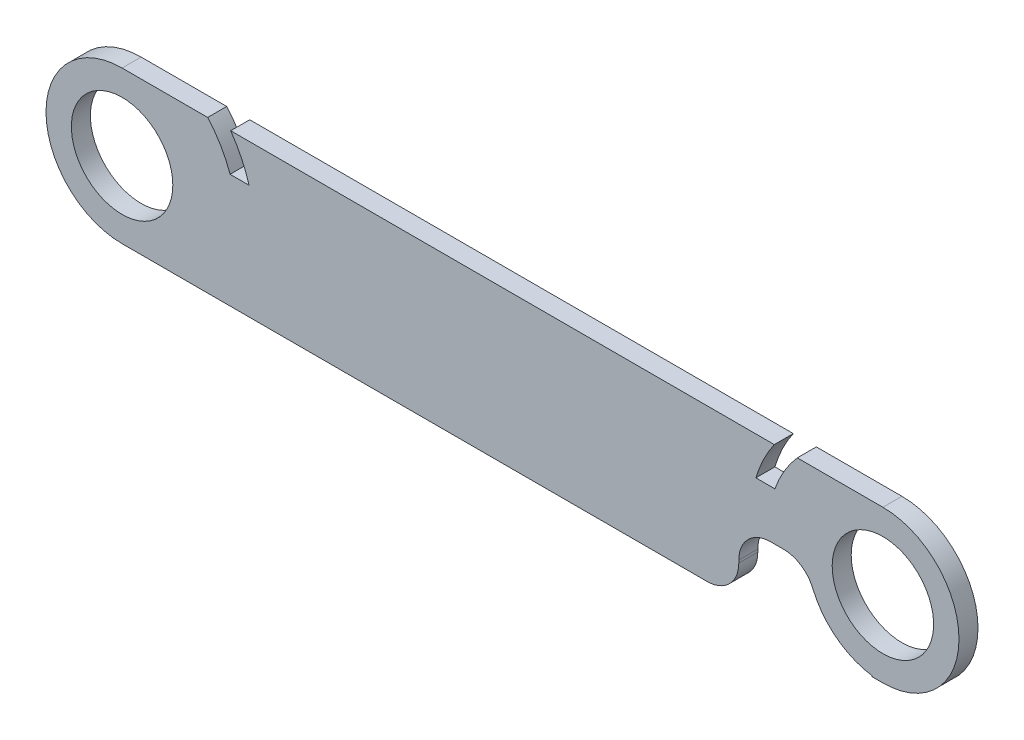
ISO-10303-21;
HEADER;
FILE_DESCRIPTION(('STEP AP214'),'2;1');
FILE_NAME('part.step','',(''),(''),'','','');
FILE_SCHEMA(('AUTOMOTIVE_DESIGN { 1 0 10303 214 1 1 1 1 }'));
ENDSEC;
DATA;
#1=APPLICATION_CONTEXT('core data for automotive mechanical design processes');
#2=APPLICATION_PROTOCOL_DEFINITION('international standard','automotive_design',2000,#1);
#3=PRODUCT_CONTEXT('',#1,'mechanical');
#4=PRODUCT('Part','Part','',(#3));
#5=PRODUCT_RELATED_PRODUCT_CATEGORY('part','',(#4));
#6=PRODUCT_DEFINITION_FORMATION('','',#4);
#7=PRODUCT_DEFINITION_CONTEXT('part definition',#1,'design');
#8=PRODUCT_DEFINITION('design','',#6,#7);
#9=PRODUCT_DEFINITION_SHAPE('','',#8);
#10=(LENGTH_UNIT() NAMED_UNIT(*) SI_UNIT(.MILLI.,.METRE.));
#11=(NAMED_UNIT(*) PLANE_ANGLE_UNIT() SI_UNIT($,.RADIAN.));
#12=(NAMED_UNIT(*) SI_UNIT($,.STERADIAN.) SOLID_ANGLE_UNIT());
#13=UNCERTAINTY_MEASURE_WITH_UNIT(LENGTH_MEASURE(1.E-05),#10,'distance_accuracy_value','');
#14=(GEOMETRIC_REPRESENTATION_CONTEXT(3) GLOBAL_UNCERTAINTY_ASSIGNED_CONTEXT((#13)) GLOBAL_UNIT_ASSIGNED_CONTEXT((#10,
#11,#12)) REPRESENTATION_CONTEXT('',''));
#15=CARTESIAN_POINT('',(0.,0.,0.));
#16=DIRECTION('',(0.,0.,1.));
#17=DIRECTION('',(1.,0.,0.));
#18=AXIS2_PLACEMENT_3D('',#15,#16,#17);
#19=CARTESIAN_POINT('',(0.,-12.,3.));
#20=DIRECTION('',(0.,1.,0.));
#21=DIRECTION('',(0.,0.,1.));
#22=AXIS2_PLACEMENT_3D('',#19,#20,#21);
#23=PLANE('',#22);
#24=DIRECTION('',(1.,0.,0.));
#25=VECTOR('',#24,1.);
#26=CARTESIAN_POINT('',(0.,-12.,3.));
#27=LINE('',#26,#25);
#28=CARTESIAN_POINT('',(-1.73119352280891,-12.,3.));
#29=VERTEX_POINT('',#28);
#30=CARTESIAN_POINT('',(0.,-12.,3.));
#31=VERTEX_POINT('',#30);
#32=EDGE_CURVE('E187',#29,#31,#27,.T.);
#33=ORIENTED_EDGE('',*,*,#32,.F.);
#34=DIRECTION('',(0.,0.,-1.));
#35=VECTOR('',#34,1.);
#36=CARTESIAN_POINT('',(-1.73119352280891,-12.,3.));
#37=LINE('',#36,#35);
#38=CARTESIAN_POINT('',(-1.73119352280891,-12.,0.));
#39=VERTEX_POINT('',#38);
#40=EDGE_CURVE('E170',#29,#39,#37,.T.);
#41=ORIENTED_EDGE('',*,*,#40,.T.);
#42=DIRECTION('',(1.,0.,0.));
#43=VECTOR('',#42,1.);
#44=CARTESIAN_POINT('',(0.,-12.,0.));
#45=LINE('',#44,#43);
#46=CARTESIAN_POINT('',(0.,-12.,0.));
#47=VERTEX_POINT('',#46);
#48=EDGE_CURVE('E215',#39,#47,#45,.T.);
#49=ORIENTED_EDGE('',*,*,#48,.T.);
#50=DIRECTION('',(0.,0.,-1.));
#51=VECTOR('',#50,1.);
#52=CARTESIAN_POINT('',(0.,-12.,3.));
#53=LINE('',#52,#51);
#54=EDGE_CURVE('E195',#31,#47,#53,.T.);
#55=ORIENTED_EDGE('',*,*,#54,.F.);
#56=EDGE_LOOP('',(#33,#41,#49,#55));
#57=FACE_BOUND('',#56,.T.);
#58=ADVANCED_FACE('F33',(#57),#23,.F.);
#59=CARTESIAN_POINT('',(0.,12.,3.));
#60=DIRECTION('',(0.,-1.,0.));
#61=DIRECTION('',(0.,0.,-1.));
#62=AXIS2_PLACEMENT_3D('',#59,#60,#61);
#63=PLANE('',#62);
#64=DIRECTION('',(-1.,0.,0.));
#65=VECTOR('',#64,1.);
#66=CARTESIAN_POINT('',(0.,12.,3.));
#67=LINE('',#66,#65);
#68=CARTESIAN_POINT('',(-106.5,12.,3.));
#69=VERTEX_POINT('',#68);
#70=CARTESIAN_POINT('',(-120.,12.,3.));
#71=VERTEX_POINT('',#70);
#72=EDGE_CURVE('E267',#69,#71,#67,.T.);
#73=ORIENTED_EDGE('',*,*,#72,.F.);
#74=DIRECTION('',(0.,0.,1.));
#75=VECTOR('',#74,1.);
#76=CARTESIAN_POINT('',(-106.5,12.,0.));
#77=LINE('',#76,#75);
#78=CARTESIAN_POINT('',(-106.5,12.,0.));
#79=VERTEX_POINT('',#78);
#80=EDGE_CURVE('E349',#79,#69,#77,.T.);
#81=ORIENTED_EDGE('',*,*,#80,.F.);
#82=DIRECTION('',(-1.,0.,0.));
#83=VECTOR('',#82,1.);
#84=CARTESIAN_POINT('',(0.,12.,0.));
#85=LINE('',#84,#83);
#86=CARTESIAN_POINT('',(-120.,12.,0.));
#87=VERTEX_POINT('',#86);
#88=EDGE_CURVE('E207',#79,#87,#85,.T.);
#89=ORIENTED_EDGE('',*,*,#88,.T.);
#90=DIRECTION('',(0.,0.,-1.));
#91=VECTOR('',#90,1.);
#92=CARTESIAN_POINT('',(-120.,12.,3.));
#93=LINE('',#92,#91);
#94=EDGE_CURVE('E224',#71,#87,#93,.T.);
#95=ORIENTED_EDGE('',*,*,#94,.F.);
#96=EDGE_LOOP('',(#73,#81,#89,#95));
#97=FACE_BOUND('',#96,.T.);
#98=ADVANCED_FACE('F285',(#97),#63,.F.);
#99=CARTESIAN_POINT('',(0.,12.,0.));
#100=VERTEX_POINT('',#99);
#101=CARTESIAN_POINT('',(-13.5,12.,0.));
#102=VERTEX_POINT('',#101);
#103=EDGE_CURVE('E209',#100,#102,#85,.T.);
#104=ORIENTED_EDGE('',*,*,#103,.T.);
#105=DIRECTION('',(0.,0.,1.));
#106=VECTOR('',#105,1.);
#107=CARTESIAN_POINT('',(-13.5,12.,0.));
#108=LINE('',#107,#106);
#109=CARTESIAN_POINT('',(-13.5,12.,3.));
#110=VERTEX_POINT('',#109);
#111=EDGE_CURVE('E368',#102,#110,#108,.T.);
#112=ORIENTED_EDGE('',*,*,#111,.T.);
#113=CARTESIAN_POINT('',(0.,12.,3.));
#114=VERTEX_POINT('',#113);
#115=EDGE_CURVE('E200',#114,#110,#67,.T.);
#116=ORIENTED_EDGE('',*,*,#115,.F.);
#117=DIRECTION('',(0.,0.,-1.));
#118=VECTOR('',#117,1.);
#119=CARTESIAN_POINT('',(0.,12.,3.));
#120=LINE('',#119,#118);
#121=EDGE_CURVE('E182',#114,#100,#120,.T.);
#122=ORIENTED_EDGE('',*,*,#121,.T.);
#123=EDGE_LOOP('',(#104,#112,#116,#122));
#124=FACE_BOUND('',#123,.T.);
#125=ADVANCED_FACE('F290',(#124),#63,.F.);
#126=CARTESIAN_POINT('',(0.,0.,3.));
#127=DIRECTION('',(0.,0.,1.));
#128=DIRECTION('',(1.,0.,0.));
#129=AXIS2_PLACEMENT_3D('',#126,#127,#128);
#130=PLANE('',#129);
#131=CARTESIAN_POINT('',(-120.,-12.,3.));
#132=VERTEX_POINT('',#131);
#133=CARTESIAN_POINT('',(-27.7311935228089,-12.,3.));
#134=VERTEX_POINT('',#133);
#135=EDGE_CURVE('E197',#132,#134,#27,.T.);
#136=ORIENTED_EDGE('',*,*,#135,.T.);
#137=CARTESIAN_POINT('',(-27.7311935228089,-7.,3.));
#138=DIRECTION('',(0.,0.,1.));
#139=DIRECTION('',(1.,0.,0.));
#140=AXIS2_PLACEMENT_3D('',#137,#138,#139);
#141=CIRCLE('',#140,5.);
#142=CARTESIAN_POINT('',(-22.7311935228089,-7.,3.));
#143=VERTEX_POINT('',#142);
#144=EDGE_CURVE('E55',#134,#143,#141,.T.);
#145=ORIENTED_EDGE('',*,*,#144,.T.);
#146=DIRECTION('',(0.,-1.,0.));
#147=VECTOR('',#146,1.);
#148=CARTESIAN_POINT('',(-22.7311935228089,-12.,3.));
#149=LINE('',#148,#147);
#150=CARTESIAN_POINT('',(-22.7311935228089,-6.57221453223144,3.));
#151=VERTEX_POINT('',#150);
#152=EDGE_CURVE('E192',#151,#143,#149,.T.);
#153=ORIENTED_EDGE('',*,*,#152,.F.);
#154=CARTESIAN_POINT('',(-17.7311935228089,-6.57221453223144,3.));
#155=DIRECTION('',(0.,0.,1.));
#156=DIRECTION('',(1.,0.,0.));
#157=AXIS2_PLACEMENT_3D('',#154,#155,#156);
#158=CIRCLE('',#157,5.);
#159=CARTESIAN_POINT('',(-17.7311935228089,-1.57221453223144,3.));
#160=VERTEX_POINT('',#159);
#161=EDGE_CURVE('E239',#151,#160,#158,.F.);
#162=ORIENTED_EDGE('',*,*,#161,.T.);
#163=DIRECTION('',(-1.,0.,0.));
#164=VECTOR('',#163,1.);
#165=CARTESIAN_POINT('',(-22.7311935228089,-1.57221453223144,3.));
#166=LINE('',#165,#164);
#167=CARTESIAN_POINT('',(-15.6608939090396,-1.57221453223144,3.));
#168=VERTEX_POINT('',#167);
#169=EDGE_CURVE('E589',#168,#160,#166,.T.);
#170=ORIENTED_EDGE('',*,*,#169,.F.);
#171=CARTESIAN_POINT('',(-15.6608939090396,-6.57221453223144,3.));
#172=DIRECTION('',(0.,0.,1.));
#173=DIRECTION('',(1.,0.,0.));
#174=AXIS2_PLACEMENT_3D('',#171,#172,#173);
#175=CIRCLE('',#174,5.);
#176=CARTESIAN_POINT('',(-11.0504201179325,-4.63739375977882,3.));
#177=VERTEX_POINT('',#176);
#178=EDGE_CURVE('E249',#168,#177,#175,.F.);
#179=ORIENTED_EDGE('',*,*,#178,.T.);
#180=CARTESIAN_POINT('',(0.,0.,3.));
#181=DIRECTION('',(0.,0.,-1.));
#182=DIRECTION('',(1.,0.,0.));
#183=AXIS2_PLACEMENT_3D('',#180,#181,#182);
#184=CIRCLE('',#183,11.9840396221826);
#185=CARTESIAN_POINT('',(-1.73119352280891,-11.8583377693767,3.));
#186=VERTEX_POINT('',#185);
#187=EDGE_CURVE('E190',#186,#177,#184,.T.);
#188=ORIENTED_EDGE('',*,*,#187,.F.);
#189=DIRECTION('',(0.,1.,0.));
#190=VECTOR('',#189,1.);
#191=CARTESIAN_POINT('',(-1.73119352280891,-11.8583377693767,3.));
#192=LINE('',#191,#190);
#193=EDGE_CURVE('E174',#29,#186,#192,.T.);
#194=ORIENTED_EDGE('',*,*,#193,.F.);
#195=ORIENTED_EDGE('',*,*,#32,.T.);
#196=CARTESIAN_POINT('',(0.,0.,3.));
#197=DIRECTION('',(0.,0.,1.));
#198=DIRECTION('',(1.,0.,0.));
#199=AXIS2_PLACEMENT_3D('',#196,#197,#198);
#200=CIRCLE('',#199,12.);
#201=EDGE_CURVE('E219',#31,#114,#200,.T.);
#202=ORIENTED_EDGE('',*,*,#201,.T.);
#203=ORIENTED_EDGE('',*,*,#115,.T.);
#204=CARTESIAN_POINT('',(0.,0.,3.));
#205=DIRECTION('',(0.,0.,-1.));
#206=DIRECTION('',(1.,0.,0.));
#207=AXIS2_PLACEMENT_3D('',#204,#205,#206);
#208=CIRCLE('',#207,18.0623918681884);
#209=CARTESIAN_POINT('',(-17.0367250374008,6.,3.));
#210=VERTEX_POINT('',#209);
#211=EDGE_CURVE('E326',#210,#110,#208,.T.);
#212=ORIENTED_EDGE('',*,*,#211,.F.);
#213=DIRECTION('',(1.,0.,0.));
#214=VECTOR('',#213,1.);
#215=CARTESIAN_POINT('',(-17.0367250374008,6.,3.));
#216=LINE('',#215,#214);
#217=CARTESIAN_POINT('',(-20.0367250374008,6.,3.));
#218=VERTEX_POINT('',#217);
#219=EDGE_CURVE('E362',#218,#210,#216,.T.);
#220=ORIENTED_EDGE('',*,*,#219,.F.);
#221=CARTESIAN_POINT('',(0.,0.,3.));
#222=DIRECTION('',(0.,0.,1.));
#223=DIRECTION('',(1.,0.,0.));
#224=AXIS2_PLACEMENT_3D('',#221,#222,#223);
#225=CIRCLE('',#224,20.915791886142);
#226=CARTESIAN_POINT('',(-17.1309763359945,12.,3.));
#227=VERTEX_POINT('',#226);
#228=EDGE_CURVE('E370',#227,#218,#225,.T.);
#229=ORIENTED_EDGE('',*,*,#228,.F.);
#230=CARTESIAN_POINT('',(-102.869023664005,12.,3.));
#231=VERTEX_POINT('',#230);
#232=EDGE_CURVE('E393',#227,#231,#67,.T.);
#233=ORIENTED_EDGE('',*,*,#232,.T.);
#234=CARTESIAN_POINT('',(-120.,0.,3.));
#235=DIRECTION('',(0.,0.,1.));
#236=DIRECTION('',(-1.,0.,0.));
#237=AXIS2_PLACEMENT_3D('',#234,#235,#236);
#238=CIRCLE('',#237,20.915791886142);
#239=CARTESIAN_POINT('',(-99.9632749625992,6.,3.));
#240=VERTEX_POINT('',#239);
#241=EDGE_CURVE('E334',#240,#231,#238,.T.);
#242=ORIENTED_EDGE('',*,*,#241,.F.);
#243=DIRECTION('',(1.,0.,0.));
#244=VECTOR('',#243,1.);
#245=CARTESIAN_POINT('',(-102.963274962599,6.,3.));
#246=LINE('',#245,#244);
#247=CARTESIAN_POINT('',(-102.963274962599,6.,3.));
#248=VERTEX_POINT('',#247);
#249=EDGE_CURVE('E344',#248,#240,#246,.T.);
#250=ORIENTED_EDGE('',*,*,#249,.F.);
#251=CARTESIAN_POINT('',(-120.,0.,3.));
#252=DIRECTION('',(0.,0.,-1.));
#253=DIRECTION('',(-1.,0.,0.));
#254=AXIS2_PLACEMENT_3D('',#251,#252,#253);
#255=CIRCLE('',#254,18.0623918681884);
#256=EDGE_CURVE('E341',#69,#248,#255,.T.);
#257=ORIENTED_EDGE('',*,*,#256,.F.);
#258=ORIENTED_EDGE('',*,*,#72,.T.);
#259=CARTESIAN_POINT('',(-120.,0.,3.));
#260=DIRECTION('',(0.,0.,1.));
#261=DIRECTION('',(1.,0.,0.));
#262=AXIS2_PLACEMENT_3D('',#259,#260,#261);
#263=CIRCLE('',#262,12.);
#264=EDGE_CURVE('E198',#71,#132,#263,.T.);
#265=ORIENTED_EDGE('',*,*,#264,.T.);
#266=EDGE_LOOP('',(#136,#145,#153,#162,#170,#179,#188,#194,#195,#202,#203,#212,#220,#229,#233,
#242,#250,#257,#258,#265));
#267=FACE_BOUND('',#266,.T.);
#268=CARTESIAN_POINT('',(-120.,0.,3.));
#269=DIRECTION('',(0.,0.,1.));
#270=DIRECTION('',(1.,0.,0.));
#271=AXIS2_PLACEMENT_3D('',#268,#269,#270);
#272=CIRCLE('',#271,8.00000000000001);
#273=CARTESIAN_POINT('',(-112.,0.,3.));
#274=VERTEX_POINT('',#273);
#275=EDGE_CURVE('E208',#274,#274,#272,.T.);
#276=ORIENTED_EDGE('',*,*,#275,.F.);
#277=EDGE_LOOP('',(#276));
#278=FACE_BOUND('',#277,.T.);
#279=CARTESIAN_POINT('',(0.,0.,3.));
#280=DIRECTION('',(0.,0.,1.));
#281=DIRECTION('',(-1.,0.,0.));
#282=AXIS2_PLACEMENT_3D('',#279,#280,#281);
#283=CIRCLE('',#282,8.);
#284=CARTESIAN_POINT('',(-8.,0.,3.));
#285=VERTEX_POINT('',#284);
#286=EDGE_CURVE('E382',#285,#285,#283,.T.);
#287=ORIENTED_EDGE('',*,*,#286,.F.);
#288=EDGE_LOOP('',(#287));
#289=FACE_BOUND('',#288,.T.);
#290=ADVANCED_FACE('F184',(#267,#278,#289),#130,.T.);
#291=CARTESIAN_POINT('',(0.,0.,0.));
#292=DIRECTION('',(0.,0.,1.));
#293=DIRECTION('',(1.,0.,0.));
#294=AXIS2_PLACEMENT_3D('',#291,#292,#293);
#295=PLANE('',#294);
#296=DIRECTION('',(0.,-1.,0.));
#297=VECTOR('',#296,1.);
#298=CARTESIAN_POINT('',(-22.7311935228089,0.,0.));
#299=LINE('',#298,#297);
#300=CARTESIAN_POINT('',(-22.7311935228089,-6.57221453223144,0.));
#301=VERTEX_POINT('',#300);
#302=CARTESIAN_POINT('',(-22.7311935228089,-7.,0.));
#303=VERTEX_POINT('',#302);
#304=EDGE_CURVE('E276',#301,#303,#299,.T.);
#305=ORIENTED_EDGE('',*,*,#304,.T.);
#306=CARTESIAN_POINT('',(-27.7311935228089,-7.,0.));
#307=DIRECTION('',(0.,0.,1.));
#308=DIRECTION('',(1.,0.,0.));
#309=AXIS2_PLACEMENT_3D('',#306,#307,#308);
#310=CIRCLE('',#309,5.);
#311=CARTESIAN_POINT('',(-27.7311935228089,-12.,0.));
#312=VERTEX_POINT('',#311);
#313=EDGE_CURVE('E11',#303,#312,#310,.F.);
#314=ORIENTED_EDGE('',*,*,#313,.T.);
#315=CARTESIAN_POINT('',(-120.,-12.,0.));
#316=VERTEX_POINT('',#315);
#317=EDGE_CURVE('E216',#316,#312,#45,.T.);
#318=ORIENTED_EDGE('',*,*,#317,.F.);
#319=CARTESIAN_POINT('',(-120.,0.,0.));
#320=DIRECTION('',(0.,0.,1.));
#321=DIRECTION('',(1.,0.,0.));
#322=AXIS2_PLACEMENT_3D('',#319,#320,#321);
#323=CIRCLE('',#322,12.);
#324=EDGE_CURVE('E212',#87,#316,#323,.T.);
#325=ORIENTED_EDGE('',*,*,#324,.F.);
#326=ORIENTED_EDGE('',*,*,#88,.F.);
#327=CARTESIAN_POINT('',(-120.,0.,0.));
#328=DIRECTION('',(0.,0.,-1.));
#329=DIRECTION('',(-1.,0.,0.));
#330=AXIS2_PLACEMENT_3D('',#327,#328,#329);
#331=CIRCLE('',#330,18.0623918681884);
#332=CARTESIAN_POINT('',(-102.963274962599,6.,0.));
#333=VERTEX_POINT('',#332);
#334=EDGE_CURVE('E330',#79,#333,#331,.T.);
#335=ORIENTED_EDGE('',*,*,#334,.T.);
#336=DIRECTION('',(1.,0.,0.));
#337=VECTOR('',#336,1.);
#338=CARTESIAN_POINT('',(-102.963274962599,6.,0.));
#339=LINE('',#338,#337);
#340=CARTESIAN_POINT('',(-99.9632749625992,6.,0.));
#341=VERTEX_POINT('',#340);
#342=EDGE_CURVE('E333',#333,#341,#339,.T.);
#343=ORIENTED_EDGE('',*,*,#342,.T.);
#344=CARTESIAN_POINT('',(-120.,0.,0.));
#345=DIRECTION('',(0.,0.,1.));
#346=DIRECTION('',(-1.,0.,0.));
#347=AXIS2_PLACEMENT_3D('',#344,#345,#346);
#348=CIRCLE('',#347,20.915791886142);
#349=CARTESIAN_POINT('',(-102.869023664005,12.,0.));
#350=VERTEX_POINT('',#349);
#351=EDGE_CURVE('E337',#341,#350,#348,.T.);
#352=ORIENTED_EDGE('',*,*,#351,.T.);
#353=CARTESIAN_POINT('',(-17.1309763359945,12.,0.));
#354=VERTEX_POINT('',#353);
#355=EDGE_CURVE('E213',#354,#350,#85,.T.);
#356=ORIENTED_EDGE('',*,*,#355,.F.);
#357=CARTESIAN_POINT('',(0.,0.,0.));
#358=DIRECTION('',(0.,0.,1.));
#359=DIRECTION('',(1.,0.,0.));
#360=AXIS2_PLACEMENT_3D('',#357,#358,#359);
#361=CIRCLE('',#360,20.915791886142);
#362=CARTESIAN_POINT('',(-20.0367250374008,6.,0.));
#363=VERTEX_POINT('',#362);
#364=EDGE_CURVE('E361',#354,#363,#361,.T.);
#365=ORIENTED_EDGE('',*,*,#364,.T.);
#366=DIRECTION('',(1.,0.,0.));
#367=VECTOR('',#366,1.);
#368=CARTESIAN_POINT('',(-17.0367250374008,6.,0.));
#369=LINE('',#368,#367);
#370=CARTESIAN_POINT('',(-17.0367250374008,6.,0.));
#371=VERTEX_POINT('',#370);
#372=EDGE_CURVE('E365',#363,#371,#369,.T.);
#373=ORIENTED_EDGE('',*,*,#372,.T.);
#374=CARTESIAN_POINT('',(0.,0.,0.));
#375=DIRECTION('',(0.,0.,-1.));
#376=DIRECTION('',(1.,0.,0.));
#377=AXIS2_PLACEMENT_3D('',#374,#375,#376);
#378=CIRCLE('',#377,18.0623918681884);
#379=EDGE_CURVE('E358',#371,#102,#378,.T.);
#380=ORIENTED_EDGE('',*,*,#379,.T.);
#381=ORIENTED_EDGE('',*,*,#103,.F.);
#382=CARTESIAN_POINT('',(0.,0.,0.));
#383=DIRECTION('',(0.,0.,1.));
#384=DIRECTION('',(1.,0.,0.));
#385=AXIS2_PLACEMENT_3D('',#382,#383,#384);
#386=CIRCLE('',#385,12.);
#387=EDGE_CURVE('E204',#47,#100,#386,.T.);
#388=ORIENTED_EDGE('',*,*,#387,.F.);
#389=ORIENTED_EDGE('',*,*,#48,.F.);
#390=DIRECTION('',(0.,1.,0.));
#391=VECTOR('',#390,1.);
#392=CARTESIAN_POINT('',(-1.73119352280889,0.,0.));
#393=LINE('',#392,#391);
#394=CARTESIAN_POINT('',(-1.73119352280891,-11.8583377693767,0.));
#395=VERTEX_POINT('',#394);
#396=EDGE_CURVE('E177',#39,#395,#393,.T.);
#397=ORIENTED_EDGE('',*,*,#396,.T.);
#398=CARTESIAN_POINT('',(0.,0.,0.));
#399=DIRECTION('',(0.,0.,1.));
#400=DIRECTION('',(1.,0.,0.));
#401=AXIS2_PLACEMENT_3D('',#398,#399,#400);
#402=CIRCLE('',#401,11.9840396221826);
#403=CARTESIAN_POINT('',(-11.0504201179325,-4.63739375977882,0.));
#404=VERTEX_POINT('',#403);
#405=EDGE_CURVE('E230',#395,#404,#402,.F.);
#406=ORIENTED_EDGE('',*,*,#405,.T.);
#407=CARTESIAN_POINT('',(-15.6608939090396,-6.57221453223144,0.));
#408=DIRECTION('',(0.,0.,1.));
#409=DIRECTION('',(1.,0.,0.));
#410=AXIS2_PLACEMENT_3D('',#407,#408,#409);
#411=CIRCLE('',#410,5.);
#412=CARTESIAN_POINT('',(-15.6608939090396,-1.57221453223144,0.));
#413=VERTEX_POINT('',#412);
#414=EDGE_CURVE('E251',#404,#413,#411,.T.);
#415=ORIENTED_EDGE('',*,*,#414,.T.);
#416=DIRECTION('',(-1.,0.,0.));
#417=VECTOR('',#416,1.);
#418=CARTESIAN_POINT('',(0.,-1.57221453223144,0.));
#419=LINE('',#418,#417);
#420=CARTESIAN_POINT('',(-17.7311935228089,-1.57221453223144,0.));
#421=VERTEX_POINT('',#420);
#422=EDGE_CURVE('E181',#413,#421,#419,.T.);
#423=ORIENTED_EDGE('',*,*,#422,.T.);
#424=CARTESIAN_POINT('',(-17.7311935228089,-6.57221453223144,0.));
#425=DIRECTION('',(0.,0.,1.));
#426=DIRECTION('',(1.,0.,0.));
#427=AXIS2_PLACEMENT_3D('',#424,#425,#426);
#428=CIRCLE('',#427,5.);
#429=EDGE_CURVE('E242',#421,#301,#428,.T.);
#430=ORIENTED_EDGE('',*,*,#429,.T.);
#431=EDGE_LOOP('',(#305,#314,#318,#325,#326,#335,#343,#352,#356,#365,#373,#380,#381,#388,#389,
#397,#406,#415,#423,#430));
#432=FACE_BOUND('',#431,.T.);
#433=CARTESIAN_POINT('',(-120.,0.,0.));
#434=DIRECTION('',(0.,0.,1.));
#435=DIRECTION('',(1.,0.,0.));
#436=AXIS2_PLACEMENT_3D('',#433,#434,#435);
#437=CIRCLE('',#436,8.00000000000001);
#438=CARTESIAN_POINT('',(-112.,0.,0.));
#439=VERTEX_POINT('',#438);
#440=EDGE_CURVE('E385',#439,#439,#437,.T.);
#441=ORIENTED_EDGE('',*,*,#440,.T.);
#442=EDGE_LOOP('',(#441));
#443=FACE_BOUND('',#442,.T.);
#444=CARTESIAN_POINT('',(0.,0.,0.));
#445=DIRECTION('',(0.,0.,1.));
#446=DIRECTION('',(-1.,0.,0.));
#447=AXIS2_PLACEMENT_3D('',#444,#445,#446);
#448=CIRCLE('',#447,8.);
#449=CARTESIAN_POINT('',(-8.,0.,0.));
#450=VERTEX_POINT('',#449);
#451=EDGE_CURVE('E351',#450,#450,#448,.T.);
#452=ORIENTED_EDGE('',*,*,#451,.T.);
#453=EDGE_LOOP('',(#452));
#454=FACE_BOUND('',#453,.T.);
#455=ADVANCED_FACE('F273',(#432,#443,#454),#295,.F.);
#456=CARTESIAN_POINT('',(0.,0.,3.));
#457=DIRECTION('',(0.,0.,-1.));
#458=DIRECTION('',(-1.,0.,0.));
#459=AXIS2_PLACEMENT_3D('',#456,#457,#458);
#460=CYLINDRICAL_SURFACE('',#459,12.);
#461=ORIENTED_EDGE('',*,*,#387,.T.);
#462=ORIENTED_EDGE('',*,*,#121,.F.);
#463=ORIENTED_EDGE('',*,*,#201,.F.);
#464=ORIENTED_EDGE('',*,*,#54,.T.);
#465=EDGE_LOOP('',(#461,#462,#463,#464));
#466=FACE_BOUND('',#465,.T.);
#467=ADVANCED_FACE('F308',(#466),#460,.T.);
#468=ORIENTED_EDGE('',*,*,#355,.T.);
#469=DIRECTION('',(0.,0.,1.));
#470=VECTOR('',#469,1.);
#471=CARTESIAN_POINT('',(-102.869023664005,12.,0.));
#472=LINE('',#471,#470);
#473=EDGE_CURVE('E352',#350,#231,#472,.T.);
#474=ORIENTED_EDGE('',*,*,#473,.T.);
#475=ORIENTED_EDGE('',*,*,#232,.F.);
#476=DIRECTION('',(0.,0.,1.));
#477=VECTOR('',#476,1.);
#478=CARTESIAN_POINT('',(-17.1309763359945,12.,0.));
#479=LINE('',#478,#477);
#480=EDGE_CURVE('E378',#354,#227,#479,.T.);
#481=ORIENTED_EDGE('',*,*,#480,.F.);
#482=EDGE_LOOP('',(#468,#474,#475,#481));
#483=FACE_BOUND('',#482,.T.);
#484=ADVANCED_FACE('F293',(#483),#63,.F.);
#485=CARTESIAN_POINT('',(-120.,0.,3.));
#486=DIRECTION('',(0.,0.,-1.));
#487=DIRECTION('',(-1.,0.,0.));
#488=AXIS2_PLACEMENT_3D('',#485,#486,#487);
#489=CYLINDRICAL_SURFACE('',#488,12.);
#490=ORIENTED_EDGE('',*,*,#324,.T.);
#491=DIRECTION('',(0.,0.,-1.));
#492=VECTOR('',#491,1.);
#493=CARTESIAN_POINT('',(-120.,-12.,3.));
#494=LINE('',#493,#492);
#495=EDGE_CURVE('E221',#132,#316,#494,.T.);
#496=ORIENTED_EDGE('',*,*,#495,.F.);
#497=ORIENTED_EDGE('',*,*,#264,.F.);
#498=ORIENTED_EDGE('',*,*,#94,.T.);
#499=EDGE_LOOP('',(#490,#496,#497,#498));
#500=FACE_BOUND('',#499,.T.);
#501=ADVANCED_FACE('F270',(#500),#489,.T.);
#502=ORIENTED_EDGE('',*,*,#317,.T.);
#503=DIRECTION('',(0.,0.,1.));
#504=VECTOR('',#503,1.);
#505=CARTESIAN_POINT('',(-27.7311935228089,-12.,3.));
#506=LINE('',#505,#504);
#507=EDGE_CURVE('E253',#312,#134,#506,.T.);
#508=ORIENTED_EDGE('',*,*,#507,.T.);
#509=ORIENTED_EDGE('',*,*,#135,.F.);
#510=ORIENTED_EDGE('',*,*,#495,.T.);
#511=EDGE_LOOP('',(#502,#508,#509,#510));
#512=FACE_BOUND('',#511,.T.);
#513=ADVANCED_FACE('F259',(#512),#23,.F.);
#514=CARTESIAN_POINT('',(-120.,0.,3.));
#515=DIRECTION('',(0.,0.,-1.));
#516=DIRECTION('',(-1.,0.,0.));
#517=AXIS2_PLACEMENT_3D('',#514,#515,#516);
#518=CYLINDRICAL_SURFACE('',#517,8.00000000000001);
#519=ORIENTED_EDGE('',*,*,#275,.T.);
#520=EDGE_LOOP('',(#519));
#521=FACE_BOUND('',#520,.T.);
#522=ORIENTED_EDGE('',*,*,#440,.F.);
#523=EDGE_LOOP('',(#522));
#524=FACE_BOUND('',#523,.T.);
#525=ADVANCED_FACE('F297',(#521,#524),#518,.F.);
#526=CARTESIAN_POINT('',(0.,0.,3.));
#527=DIRECTION('',(0.,0.,-1.));
#528=DIRECTION('',(-1.,0.,0.));
#529=AXIS2_PLACEMENT_3D('',#526,#527,#528);
#530=CYLINDRICAL_SURFACE('',#529,8.);
#531=ORIENTED_EDGE('',*,*,#286,.T.);
#532=EDGE_LOOP('',(#531));
#533=FACE_BOUND('',#532,.T.);
#534=ORIENTED_EDGE('',*,*,#451,.F.);
#535=EDGE_LOOP('',(#534));
#536=FACE_BOUND('',#535,.T.);
#537=ADVANCED_FACE('F302',(#533,#536),#530,.F.);
#538=CARTESIAN_POINT('',(0.,0.,0.));
#539=DIRECTION('',(0.,0.,1.));
#540=DIRECTION('',(1.,0.,0.));
#541=AXIS2_PLACEMENT_3D('',#538,#539,#540);
#542=CYLINDRICAL_SURFACE('',#541,18.0623918681884);
#543=ORIENTED_EDGE('',*,*,#211,.T.);
#544=ORIENTED_EDGE('',*,*,#111,.F.);
#545=ORIENTED_EDGE('',*,*,#379,.F.);
#546=DIRECTION('',(0.,0.,1.));
#547=VECTOR('',#546,1.);
#548=CARTESIAN_POINT('',(-17.0367250374008,6.,0.));
#549=LINE('',#548,#547);
#550=EDGE_CURVE('E345',#371,#210,#549,.T.);
#551=ORIENTED_EDGE('',*,*,#550,.T.);
#552=EDGE_LOOP('',(#543,#544,#545,#551));
#553=FACE_BOUND('',#552,.T.);
#554=ADVANCED_FACE('F427',(#553),#542,.T.);
#555=CARTESIAN_POINT('',(-17.0367250374008,6.,0.));
#556=DIRECTION('',(0.,-1.,0.));
#557=DIRECTION('',(0.,0.,-1.));
#558=AXIS2_PLACEMENT_3D('',#555,#556,#557);
#559=PLANE('',#558);
#560=ORIENTED_EDGE('',*,*,#219,.T.);
#561=ORIENTED_EDGE('',*,*,#550,.F.);
#562=ORIENTED_EDGE('',*,*,#372,.F.);
#563=DIRECTION('',(0.,0.,1.));
#564=VECTOR('',#563,1.);
#565=CARTESIAN_POINT('',(-20.0367250374008,6.,0.));
#566=LINE('',#565,#564);
#567=EDGE_CURVE('E376',#363,#218,#566,.T.);
#568=ORIENTED_EDGE('',*,*,#567,.T.);
#569=EDGE_LOOP('',(#560,#561,#562,#568));
#570=FACE_BOUND('',#569,.T.);
#571=ADVANCED_FACE('F421',(#570),#559,.F.);
#572=CARTESIAN_POINT('',(0.,0.,0.));
#573=DIRECTION('',(0.,0.,1.));
#574=DIRECTION('',(1.,0.,0.));
#575=AXIS2_PLACEMENT_3D('',#572,#573,#574);
#576=CYLINDRICAL_SURFACE('',#575,20.915791886142);
#577=ORIENTED_EDGE('',*,*,#228,.T.);
#578=ORIENTED_EDGE('',*,*,#567,.F.);
#579=ORIENTED_EDGE('',*,*,#364,.F.);
#580=ORIENTED_EDGE('',*,*,#480,.T.);
#581=EDGE_LOOP('',(#577,#578,#579,#580));
#582=FACE_BOUND('',#581,.T.);
#583=ADVANCED_FACE('F414',(#582),#576,.F.);
#584=CARTESIAN_POINT('',(-120.,0.,0.));
#585=DIRECTION('',(0.,0.,1.));
#586=DIRECTION('',(1.,0.,0.));
#587=AXIS2_PLACEMENT_3D('',#584,#585,#586);
#588=CYLINDRICAL_SURFACE('',#587,18.0623918681884);
#589=ORIENTED_EDGE('',*,*,#256,.T.);
#590=DIRECTION('',(0.,0.,1.));
#591=VECTOR('',#590,1.);
#592=CARTESIAN_POINT('',(-102.963274962599,6.,0.));
#593=LINE('',#592,#591);
#594=EDGE_CURVE('E340',#333,#248,#593,.T.);
#595=ORIENTED_EDGE('',*,*,#594,.F.);
#596=ORIENTED_EDGE('',*,*,#334,.F.);
#597=ORIENTED_EDGE('',*,*,#80,.T.);
#598=EDGE_LOOP('',(#589,#595,#596,#597));
#599=FACE_BOUND('',#598,.T.);
#600=ADVANCED_FACE('F412',(#599),#588,.T.);
#601=CARTESIAN_POINT('',(-120.,0.,0.));
#602=DIRECTION('',(0.,0.,1.));
#603=DIRECTION('',(1.,0.,0.));
#604=AXIS2_PLACEMENT_3D('',#601,#602,#603);
#605=CYLINDRICAL_SURFACE('',#604,20.915791886142);
#606=ORIENTED_EDGE('',*,*,#241,.T.);
#607=ORIENTED_EDGE('',*,*,#473,.F.);
#608=ORIENTED_EDGE('',*,*,#351,.F.);
#609=DIRECTION('',(0.,0.,1.));
#610=VECTOR('',#609,1.);
#611=CARTESIAN_POINT('',(-99.9632749625992,6.,0.));
#612=LINE('',#611,#610);
#613=EDGE_CURVE('E355',#341,#240,#612,.T.);
#614=ORIENTED_EDGE('',*,*,#613,.T.);
#615=EDGE_LOOP('',(#606,#607,#608,#614));
#616=FACE_BOUND('',#615,.T.);
#617=ADVANCED_FACE('F406',(#616),#605,.F.);
#618=CARTESIAN_POINT('',(-102.963274962599,6.,0.));
#619=DIRECTION('',(0.,-1.,0.));
#620=DIRECTION('',(0.,0.,-1.));
#621=AXIS2_PLACEMENT_3D('',#618,#619,#620);
#622=PLANE('',#621);
#623=ORIENTED_EDGE('',*,*,#249,.T.);
#624=ORIENTED_EDGE('',*,*,#613,.F.);
#625=ORIENTED_EDGE('',*,*,#342,.F.);
#626=ORIENTED_EDGE('',*,*,#594,.T.);
#627=EDGE_LOOP('',(#623,#624,#625,#626));
#628=FACE_BOUND('',#627,.T.);
#629=ADVANCED_FACE('F409',(#628),#622,.F.);
#630=CARTESIAN_POINT('',(0.,0.,-7.));
#631=DIRECTION('',(0.,0.,1.));
#632=DIRECTION('',(1.,0.,0.));
#633=AXIS2_PLACEMENT_3D('',#630,#631,#632);
#634=CYLINDRICAL_SURFACE('',#633,11.9840396221826);
#635=ORIENTED_EDGE('',*,*,#187,.T.);
#636=DIRECTION('',(0.,0.,1.));
#637=VECTOR('',#636,1.);
#638=CARTESIAN_POINT('',(-11.0504201179325,-4.63739375977882,-7.));
#639=LINE('',#638,#637);
#640=EDGE_CURVE('E247',#177,#404,#639,.F.);
#641=ORIENTED_EDGE('',*,*,#640,.T.);
#642=ORIENTED_EDGE('',*,*,#405,.F.);
#643=DIRECTION('',(0.,0.,1.));
#644=VECTOR('',#643,1.);
#645=CARTESIAN_POINT('',(-1.73119352280891,-11.8583377693767,-7.));
#646=LINE('',#645,#644);
#647=EDGE_CURVE('E191',#395,#186,#646,.T.);
#648=ORIENTED_EDGE('',*,*,#647,.T.);
#649=EDGE_LOOP('',(#635,#641,#642,#648));
#650=FACE_BOUND('',#649,.T.);
#651=ADVANCED_FACE('F493',(#650),#634,.T.);
#652=CARTESIAN_POINT('',(-22.7311935228089,-1.57221453223144,-7.));
#653=DIRECTION('',(0.,1.,0.));
#654=DIRECTION('',(0.,0.,1.));
#655=AXIS2_PLACEMENT_3D('',#652,#653,#654);
#656=PLANE('',#655);
#657=ORIENTED_EDGE('',*,*,#422,.F.);
#658=DIRECTION('',(0.,0.,-1.));
#659=VECTOR('',#658,1.);
#660=CARTESIAN_POINT('',(-15.6608939090396,-1.57221453223144,3.));
#661=LINE('',#660,#659);
#662=EDGE_CURVE('E244',#413,#168,#661,.F.);
#663=ORIENTED_EDGE('',*,*,#662,.T.);
#664=ORIENTED_EDGE('',*,*,#169,.T.);
#665=DIRECTION('',(0.,0.,1.));
#666=VECTOR('',#665,1.);
#667=CARTESIAN_POINT('',(-17.7311935228089,-1.57221453223144,0.));
#668=LINE('',#667,#666);
#669=EDGE_CURVE('E236',#160,#421,#668,.F.);
#670=ORIENTED_EDGE('',*,*,#669,.T.);
#671=EDGE_LOOP('',(#657,#663,#664,#670));
#672=FACE_BOUND('',#671,.T.);
#673=ADVANCED_FACE('F507',(#672),#656,.F.);
#674=CARTESIAN_POINT('',(-1.73119352280891,-11.8583377693767,-7.));
#675=DIRECTION('',(1.,0.,0.));
#676=DIRECTION('',(0.,1.,0.));
#677=AXIS2_PLACEMENT_3D('',#674,#675,#676);
#678=PLANE('',#677);
#679=ORIENTED_EDGE('',*,*,#40,.F.);
#680=ORIENTED_EDGE('',*,*,#193,.T.);
#681=ORIENTED_EDGE('',*,*,#647,.F.);
#682=ORIENTED_EDGE('',*,*,#396,.F.);
#683=EDGE_LOOP('',(#679,#680,#681,#682));
#684=FACE_BOUND('',#683,.T.);
#685=ADVANCED_FACE('F172',(#684),#678,.F.);
#686=CARTESIAN_POINT('',(-22.7311935228089,-12.,-7.));
#687=DIRECTION('',(-1.,0.,0.));
#688=DIRECTION('',(0.,0.,1.));
#689=AXIS2_PLACEMENT_3D('',#686,#687,#688);
#690=PLANE('',#689);
#691=ORIENTED_EDGE('',*,*,#152,.T.);
#692=DIRECTION('',(0.,0.,1.));
#693=VECTOR('',#692,1.);
#694=CARTESIAN_POINT('',(-22.7311935228089,-7.,-7.));
#695=LINE('',#694,#693);
#696=EDGE_CURVE('E41',#143,#303,#695,.F.);
#697=ORIENTED_EDGE('',*,*,#696,.T.);
#698=ORIENTED_EDGE('',*,*,#304,.F.);
#699=DIRECTION('',(0.,0.,1.));
#700=VECTOR('',#699,1.);
#701=CARTESIAN_POINT('',(-22.7311935228089,-6.57221453223144,3.));
#702=LINE('',#701,#700);
#703=EDGE_CURVE('E233',#301,#151,#702,.T.);
#704=ORIENTED_EDGE('',*,*,#703,.T.);
#705=EDGE_LOOP('',(#691,#697,#698,#704));
#706=FACE_BOUND('',#705,.T.);
#707=ADVANCED_FACE('F315',(#706),#690,.F.);
#708=CARTESIAN_POINT('',(-17.7311935228089,-6.57221453223144,-7.));
#709=DIRECTION('',(0.,0.,-1.));
#710=DIRECTION('',(-1.,0.,0.));
#711=AXIS2_PLACEMENT_3D('',#708,#709,#710);
#712=CYLINDRICAL_SURFACE('',#711,5.);
#713=ORIENTED_EDGE('',*,*,#429,.F.);
#714=ORIENTED_EDGE('',*,*,#669,.F.);
#715=ORIENTED_EDGE('',*,*,#161,.F.);
#716=ORIENTED_EDGE('',*,*,#703,.F.);
#717=EDGE_LOOP('',(#713,#714,#715,#716));
#718=FACE_BOUND('',#717,.T.);
#719=ADVANCED_FACE('F282',(#718),#712,.F.);
#720=CARTESIAN_POINT('',(-15.6608939090396,-6.57221453223144,-7.));
#721=DIRECTION('',(0.,0.,1.));
#722=DIRECTION('',(1.,0.,0.));
#723=AXIS2_PLACEMENT_3D('',#720,#721,#722);
#724=CYLINDRICAL_SURFACE('',#723,5.);
#725=ORIENTED_EDGE('',*,*,#414,.F.);
#726=ORIENTED_EDGE('',*,*,#640,.F.);
#727=ORIENTED_EDGE('',*,*,#178,.F.);
#728=ORIENTED_EDGE('',*,*,#662,.F.);
#729=EDGE_LOOP('',(#725,#726,#727,#728));
#730=FACE_BOUND('',#729,.T.);
#731=ADVANCED_FACE('F278',(#730),#724,.F.);
#732=CARTESIAN_POINT('',(-27.7311935228089,-7.,3.));
#733=DIRECTION('',(0.,0.,1.));
#734=DIRECTION('',(1.,0.,0.));
#735=AXIS2_PLACEMENT_3D('',#732,#733,#734);
#736=CYLINDRICAL_SURFACE('',#735,5.);
#737=ORIENTED_EDGE('',*,*,#313,.F.);
#738=ORIENTED_EDGE('',*,*,#696,.F.);
#739=ORIENTED_EDGE('',*,*,#144,.F.);
#740=ORIENTED_EDGE('',*,*,#507,.F.);
#741=EDGE_LOOP('',(#737,#738,#739,#740));
#742=FACE_BOUND('',#741,.T.);
#743=ADVANCED_FACE('F35',(#742),#736,.T.);
#744=CLOSED_SHELL('',(#58,#98,#125,#290,#455,#467,#484,#501,#513,#525,#537,#554,#571,#583,#600,
#617,#629,#651,#673,#685,#707,#719,#731,#743));
#745=MANIFOLD_SOLID_BREP('B2',#744);
#746=ADVANCED_BREP_SHAPE_REPRESENTATION('',(#18,#745),#14);
#747=SHAPE_DEFINITION_REPRESENTATION(#9,#746);
ENDSEC;
END-ISO-10303-21;
